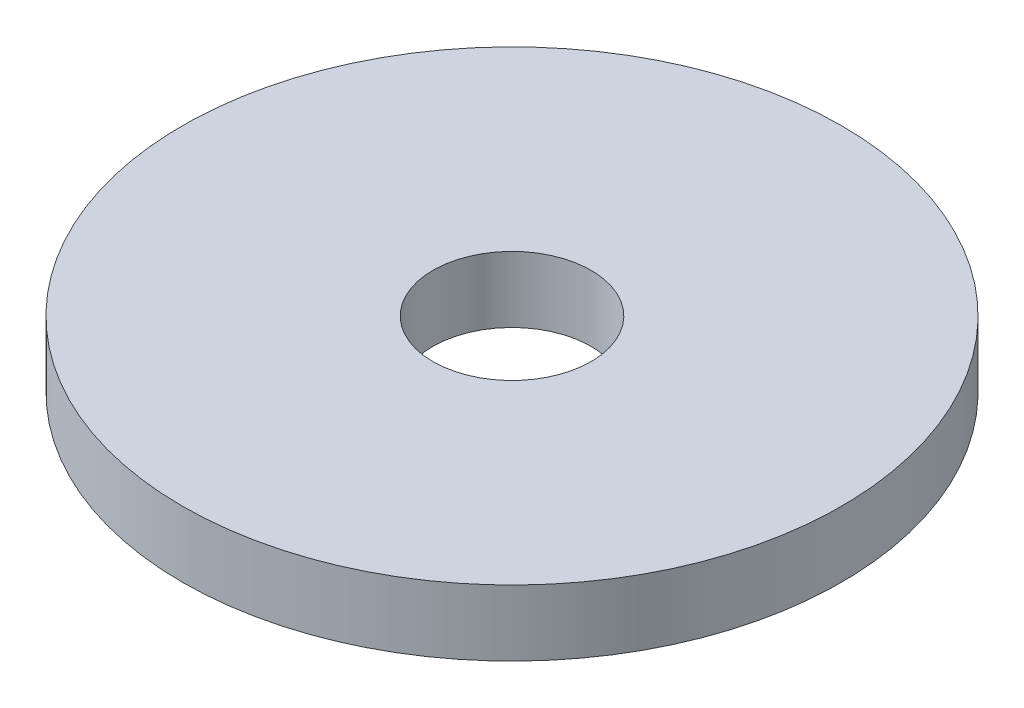
ISO-10303-21;
HEADER;
FILE_DESCRIPTION(('STEP AP214'),'2;1');
FILE_NAME('part.step','',(''),(''),'','','');
FILE_SCHEMA(('AUTOMOTIVE_DESIGN { 1 0 10303 214 1 1 1 1 }'));
ENDSEC;
DATA;
#1=APPLICATION_CONTEXT('core data for automotive mechanical design processes');
#2=APPLICATION_PROTOCOL_DEFINITION('international standard','automotive_design',2000,#1);
#3=PRODUCT_CONTEXT('',#1,'mechanical');
#4=PRODUCT('Part','Part','',(#3));
#5=PRODUCT_RELATED_PRODUCT_CATEGORY('part','',(#4));
#6=PRODUCT_DEFINITION_FORMATION('','',#4);
#7=PRODUCT_DEFINITION_CONTEXT('part definition',#1,'design');
#8=PRODUCT_DEFINITION('design','',#6,#7);
#9=PRODUCT_DEFINITION_SHAPE('','',#8);
#10=(LENGTH_UNIT() NAMED_UNIT(*) SI_UNIT(.MILLI.,.METRE.));
#11=(NAMED_UNIT(*) PLANE_ANGLE_UNIT() SI_UNIT($,.RADIAN.));
#12=(NAMED_UNIT(*) SI_UNIT($,.STERADIAN.) SOLID_ANGLE_UNIT());
#13=UNCERTAINTY_MEASURE_WITH_UNIT(LENGTH_MEASURE(1.E-05),#10,'distance_accuracy_value','');
#14=(GEOMETRIC_REPRESENTATION_CONTEXT(3) GLOBAL_UNCERTAINTY_ASSIGNED_CONTEXT((#13)) GLOBAL_UNIT_ASSIGNED_CONTEXT((#10,
#11,#12)) REPRESENTATION_CONTEXT('',''));
#15=CARTESIAN_POINT('',(0.,0.,0.));
#16=DIRECTION('',(0.,0.,1.));
#17=DIRECTION('',(1.,0.,0.));
#18=AXIS2_PLACEMENT_3D('',#15,#16,#17);
#19=CARTESIAN_POINT('',(0.,5.,0.));
#20=DIRECTION('',(0.,1.,0.));
#21=DIRECTION('',(0.,0.,1.));
#22=AXIS2_PLACEMENT_3D('',#19,#20,#21);
#23=PLANE('',#22);
#24=CARTESIAN_POINT('',(0.,5.,0.));
#25=DIRECTION('',(0.,1.,0.));
#26=DIRECTION('',(0.,0.,1.));
#27=AXIS2_PLACEMENT_3D('',#24,#25,#26);
#28=CIRCLE('',#27,25.);
#29=CARTESIAN_POINT('',(0.,5.,25.));
#30=VERTEX_POINT('',#29);
#31=EDGE_CURVE('E10',#30,#30,#28,.T.);
#32=ORIENTED_EDGE('',*,*,#31,.T.);
#33=EDGE_LOOP('',(#32));
#34=FACE_BOUND('',#33,.T.);
#35=CARTESIAN_POINT('',(0.,5.,0.));
#36=DIRECTION('',(0.,1.,0.));
#37=DIRECTION('',(0.,0.,1.));
#38=AXIS2_PLACEMENT_3D('',#35,#36,#37);
#39=CIRCLE('',#38,6.);
#40=CARTESIAN_POINT('',(0.,5.,6.));
#41=VERTEX_POINT('',#40);
#42=EDGE_CURVE('E43',#41,#41,#39,.T.);
#43=ORIENTED_EDGE('',*,*,#42,.F.);
#44=EDGE_LOOP('',(#43));
#45=FACE_BOUND('',#44,.T.);
#46=ADVANCED_FACE('F32',(#34,#45),#23,.T.);
#47=CARTESIAN_POINT('',(0.,0.,0.));
#48=DIRECTION('',(0.,1.,0.));
#49=DIRECTION('',(0.,0.,1.));
#50=AXIS2_PLACEMENT_3D('',#47,#48,#49);
#51=PLANE('',#50);
#52=CARTESIAN_POINT('',(0.,0.,0.));
#53=DIRECTION('',(0.,1.,0.));
#54=DIRECTION('',(0.,0.,1.));
#55=AXIS2_PLACEMENT_3D('',#52,#53,#54);
#56=CIRCLE('',#55,25.);
#57=CARTESIAN_POINT('',(0.,0.,25.));
#58=VERTEX_POINT('',#57);
#59=EDGE_CURVE('E36',#58,#58,#56,.T.);
#60=ORIENTED_EDGE('',*,*,#59,.F.);
#61=EDGE_LOOP('',(#60));
#62=FACE_BOUND('',#61,.T.);
#63=CARTESIAN_POINT('',(0.,0.,0.));
#64=DIRECTION('',(0.,1.,0.));
#65=DIRECTION('',(0.,0.,1.));
#66=AXIS2_PLACEMENT_3D('',#63,#64,#65);
#67=CIRCLE('',#66,6.);
#68=CARTESIAN_POINT('',(0.,0.,6.));
#69=VERTEX_POINT('',#68);
#70=EDGE_CURVE('E45',#69,#69,#67,.T.);
#71=ORIENTED_EDGE('',*,*,#70,.T.);
#72=EDGE_LOOP('',(#71));
#73=FACE_BOUND('',#72,.T.);
#74=ADVANCED_FACE('F55',(#62,#73),#51,.F.);
#75=CARTESIAN_POINT('',(0.,5.,0.));
#76=DIRECTION('',(0.,-1.,0.));
#77=DIRECTION('',(0.,0.,-1.));
#78=AXIS2_PLACEMENT_3D('',#75,#76,#77);
#79=CYLINDRICAL_SURFACE('',#78,25.);
#80=ORIENTED_EDGE('',*,*,#31,.F.);
#81=EDGE_LOOP('',(#80));
#82=FACE_BOUND('',#81,.T.);
#83=ORIENTED_EDGE('',*,*,#59,.T.);
#84=EDGE_LOOP('',(#83));
#85=FACE_BOUND('',#84,.T.);
#86=ADVANCED_FACE('F34',(#82,#85),#79,.T.);
#87=CARTESIAN_POINT('',(0.,5.,0.));
#88=DIRECTION('',(0.,-1.,0.));
#89=DIRECTION('',(0.,0.,-1.));
#90=AXIS2_PLACEMENT_3D('',#87,#88,#89);
#91=CYLINDRICAL_SURFACE('',#90,6.);
#92=ORIENTED_EDGE('',*,*,#42,.T.);
#93=EDGE_LOOP('',(#92));
#94=FACE_BOUND('',#93,.T.);
#95=ORIENTED_EDGE('',*,*,#70,.F.);
#96=EDGE_LOOP('',(#95));
#97=FACE_BOUND('',#96,.T.);
#98=ADVANCED_FACE('F51',(#94,#97),#91,.F.);
#99=CLOSED_SHELL('',(#46,#74,#86,#98));
#100=MANIFOLD_SOLID_BREP('B2',#99);
#101=ADVANCED_BREP_SHAPE_REPRESENTATION('',(#18,#100),#14);
#102=SHAPE_DEFINITION_REPRESENTATION(#9,#101);
ENDSEC;
END-ISO-10303-21;
